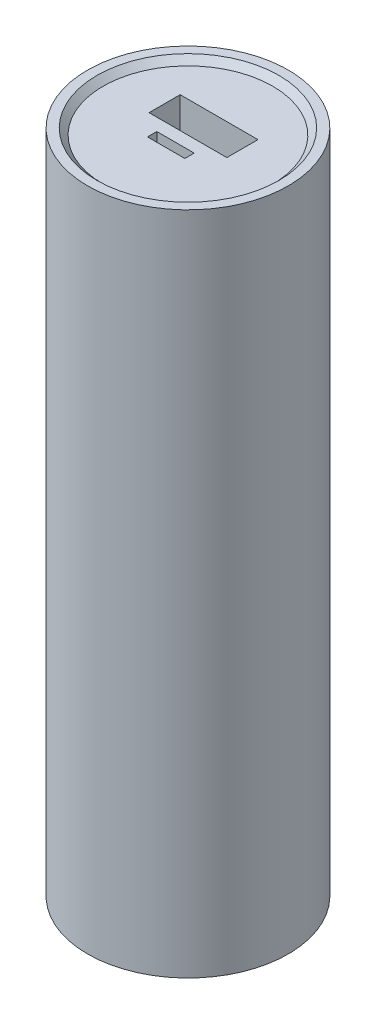
ISO-10303-21;
HEADER;
FILE_DESCRIPTION(('STEP AP214'),'2;1');
FILE_NAME('part.step','',(''),(''),'','','');
FILE_SCHEMA(('AUTOMOTIVE_DESIGN { 1 0 10303 214 1 1 1 1 }'));
ENDSEC;
DATA;
#1=APPLICATION_CONTEXT('core data for automotive mechanical design processes');
#2=APPLICATION_PROTOCOL_DEFINITION('international standard','automotive_design',2000,#1);
#3=PRODUCT_CONTEXT('',#1,'mechanical');
#4=PRODUCT('Part','Part','',(#3));
#5=PRODUCT_RELATED_PRODUCT_CATEGORY('part','',(#4));
#6=PRODUCT_DEFINITION_FORMATION('','',#4);
#7=PRODUCT_DEFINITION_CONTEXT('part definition',#1,'design');
#8=PRODUCT_DEFINITION('design','',#6,#7);
#9=PRODUCT_DEFINITION_SHAPE('','',#8);
#10=(LENGTH_UNIT() NAMED_UNIT(*) SI_UNIT(.MILLI.,.METRE.));
#11=(NAMED_UNIT(*) PLANE_ANGLE_UNIT() SI_UNIT($,.RADIAN.));
#12=(NAMED_UNIT(*) SI_UNIT($,.STERADIAN.) SOLID_ANGLE_UNIT());
#13=UNCERTAINTY_MEASURE_WITH_UNIT(LENGTH_MEASURE(1.E-05),#10,'distance_accuracy_value','');
#14=(GEOMETRIC_REPRESENTATION_CONTEXT(3) GLOBAL_UNCERTAINTY_ASSIGNED_CONTEXT((#13)) GLOBAL_UNIT_ASSIGNED_CONTEXT((#10,
#11,#12)) REPRESENTATION_CONTEXT('',''));
#15=CARTESIAN_POINT('',(0.,0.,0.));
#16=DIRECTION('',(0.,0.,1.));
#17=DIRECTION('',(1.,0.,0.));
#18=AXIS2_PLACEMENT_3D('',#15,#16,#17);
#19=CARTESIAN_POINT('',(0.,106.9,0.));
#20=DIRECTION('',(0.,-1.,0.));
#21=DIRECTION('',(0.,0.,-1.));
#22=AXIS2_PLACEMENT_3D('',#19,#20,#21);
#23=CYLINDRICAL_SURFACE('',#22,16.125);
#24=CARTESIAN_POINT('',(0.,106.9,0.));
#25=DIRECTION('',(0.,1.,0.));
#26=DIRECTION('',(0.,0.,1.));
#27=AXIS2_PLACEMENT_3D('',#24,#25,#26);
#28=CIRCLE('',#27,16.125);
#29=CARTESIAN_POINT('',(0.,106.9,16.125));
#30=VERTEX_POINT('',#29);
#31=EDGE_CURVE('E48',#30,#30,#28,.T.);
#32=ORIENTED_EDGE('',*,*,#31,.F.);
#33=EDGE_LOOP('',(#32));
#34=FACE_BOUND('',#33,.T.);
#35=CARTESIAN_POINT('',(0.,0.,0.));
#36=DIRECTION('',(0.,1.,0.));
#37=DIRECTION('',(0.,0.,1.));
#38=AXIS2_PLACEMENT_3D('',#35,#36,#37);
#39=CIRCLE('',#38,16.125);
#40=CARTESIAN_POINT('',(0.,0.,16.125));
#41=VERTEX_POINT('',#40);
#42=EDGE_CURVE('E178',#41,#41,#39,.T.);
#43=ORIENTED_EDGE('',*,*,#42,.T.);
#44=EDGE_LOOP('',(#43));
#45=FACE_BOUND('',#44,.T.);
#46=ADVANCED_FACE('F39',(#34,#45),#23,.T.);
#47=CARTESIAN_POINT('',(0.,106.9,0.));
#48=DIRECTION('',(0.,1.,0.));
#49=DIRECTION('',(0.,0.,1.));
#50=AXIS2_PLACEMENT_3D('',#47,#48,#49);
#51=PLANE('',#50);
#52=CARTESIAN_POINT('',(0.,106.9,0.));
#53=DIRECTION('',(0.,1.,0.));
#54=DIRECTION('',(0.,0.,1.));
#55=AXIS2_PLACEMENT_3D('',#52,#53,#54);
#56=CIRCLE('',#55,14.625);
#57=CARTESIAN_POINT('',(0.,106.9,14.625));
#58=VERTEX_POINT('',#57);
#59=EDGE_CURVE('E142',#58,#58,#56,.T.);
#60=ORIENTED_EDGE('',*,*,#59,.F.);
#61=EDGE_LOOP('',(#60));
#62=FACE_BOUND('',#61,.T.);
#63=ORIENTED_EDGE('',*,*,#31,.T.);
#64=EDGE_LOOP('',(#63));
#65=FACE_BOUND('',#64,.T.);
#66=ADVANCED_FACE('F187',(#62,#65),#51,.T.);
#67=CARTESIAN_POINT('',(0.,0.,0.));
#68=DIRECTION('',(0.,1.,0.));
#69=DIRECTION('',(0.,0.,1.));
#70=AXIS2_PLACEMENT_3D('',#67,#68,#69);
#71=PLANE('',#70);
#72=ORIENTED_EDGE('',*,*,#42,.F.);
#73=EDGE_LOOP('',(#72));
#74=FACE_BOUND('',#73,.T.);
#75=ADVANCED_FACE('F184',(#74),#71,.F.);
#76=CARTESIAN_POINT('',(0.,105.9,0.));
#77=DIRECTION('',(0.,1.,0.));
#78=DIRECTION('',(0.,0.,1.));
#79=AXIS2_PLACEMENT_3D('',#76,#77,#78);
#80=PLANE('',#79);
#81=DIRECTION('',(0.,0.,1.));
#82=VECTOR('',#81,1.);
#83=CARTESIAN_POINT('',(-6.25,105.9,0.));
#84=LINE('',#83,#82);
#85=CARTESIAN_POINT('',(-6.25,105.9,-5.));
#86=VERTEX_POINT('',#85);
#87=CARTESIAN_POINT('',(-6.25,105.9,0.));
#88=VERTEX_POINT('',#87);
#89=EDGE_CURVE('E112',#86,#88,#84,.T.);
#90=ORIENTED_EDGE('',*,*,#89,.F.);
#91=DIRECTION('',(-1.,0.,0.));
#92=VECTOR('',#91,1.);
#93=CARTESIAN_POINT('',(6.25,105.9,-5.));
#94=LINE('',#93,#92);
#95=CARTESIAN_POINT('',(6.25,105.9,-5.));
#96=VERTEX_POINT('',#95);
#97=EDGE_CURVE('E129',#96,#86,#94,.T.);
#98=ORIENTED_EDGE('',*,*,#97,.F.);
#99=DIRECTION('',(0.,0.,-1.));
#100=VECTOR('',#99,1.);
#101=CARTESIAN_POINT('',(6.25,105.9,0.));
#102=LINE('',#101,#100);
#103=CARTESIAN_POINT('',(6.25,105.9,0.));
#104=VERTEX_POINT('',#103);
#105=EDGE_CURVE('E55',#104,#96,#102,.T.);
#106=ORIENTED_EDGE('',*,*,#105,.F.);
#107=DIRECTION('',(1.,0.,0.));
#108=VECTOR('',#107,1.);
#109=CARTESIAN_POINT('',(6.25,105.9,0.));
#110=LINE('',#109,#108);
#111=EDGE_CURVE('E137',#88,#104,#110,.T.);
#112=ORIENTED_EDGE('',*,*,#111,.F.);
#113=EDGE_LOOP('',(#90,#98,#106,#112));
#114=FACE_BOUND('',#113,.T.);
#115=DIRECTION('',(0.,0.,1.));
#116=VECTOR('',#115,1.);
#117=CARTESIAN_POINT('',(-3.,105.9,3.5));
#118=LINE('',#117,#116);
#119=CARTESIAN_POINT('',(-3.,105.9,2.));
#120=VERTEX_POINT('',#119);
#121=CARTESIAN_POINT('',(-3.,105.9,3.5));
#122=VERTEX_POINT('',#121);
#123=EDGE_CURVE('E63',#120,#122,#118,.T.);
#124=ORIENTED_EDGE('',*,*,#123,.F.);
#125=DIRECTION('',(-1.,0.,0.));
#126=VECTOR('',#125,1.);
#127=CARTESIAN_POINT('',(3.,105.9,2.));
#128=LINE('',#127,#126);
#129=CARTESIAN_POINT('',(3.,105.9,2.));
#130=VERTEX_POINT('',#129);
#131=EDGE_CURVE('E155',#130,#120,#128,.T.);
#132=ORIENTED_EDGE('',*,*,#131,.F.);
#133=DIRECTION('',(0.,0.,-1.));
#134=VECTOR('',#133,1.);
#135=CARTESIAN_POINT('',(3.,105.9,3.5));
#136=LINE('',#135,#134);
#137=CARTESIAN_POINT('',(3.,105.9,3.5));
#138=VERTEX_POINT('',#137);
#139=EDGE_CURVE('E158',#138,#130,#136,.T.);
#140=ORIENTED_EDGE('',*,*,#139,.F.);
#141=DIRECTION('',(1.,0.,0.));
#142=VECTOR('',#141,1.);
#143=CARTESIAN_POINT('',(3.,105.9,3.5));
#144=LINE('',#143,#142);
#145=EDGE_CURVE('E162',#122,#138,#144,.T.);
#146=ORIENTED_EDGE('',*,*,#145,.F.);
#147=EDGE_LOOP('',(#124,#132,#140,#146));
#148=FACE_BOUND('',#147,.T.);
#149=CARTESIAN_POINT('',(0.,105.9,0.));
#150=DIRECTION('',(0.,1.,0.));
#151=DIRECTION('',(0.,0.,1.));
#152=AXIS2_PLACEMENT_3D('',#149,#150,#151);
#153=CIRCLE('',#152,13.625);
#154=CARTESIAN_POINT('',(0.,105.9,13.625));
#155=VERTEX_POINT('',#154);
#156=EDGE_CURVE('E11',#155,#155,#153,.T.);
#157=ORIENTED_EDGE('',*,*,#156,.T.);
#158=EDGE_LOOP('',(#157));
#159=FACE_BOUND('',#158,.T.);
#160=ADVANCED_FACE('F186',(#114,#148,#159),#80,.T.);
#161=CARTESIAN_POINT('',(0.,105.9,0.));
#162=DIRECTION('',(0.,1.,0.));
#163=DIRECTION('',(0.,0.,1.));
#164=AXIS2_PLACEMENT_3D('',#161,#162,#163);
#165=CONICAL_SURFACE('',#164,13.625,0.78539816339745);
#166=ORIENTED_EDGE('',*,*,#59,.T.);
#167=EDGE_LOOP('',(#166));
#168=FACE_BOUND('',#167,.T.);
#169=ORIENTED_EDGE('',*,*,#156,.F.);
#170=EDGE_LOOP('',(#169));
#171=FACE_BOUND('',#170,.T.);
#172=ADVANCED_FACE('F42',(#168,#171),#165,.F.);
#173=CARTESIAN_POINT('',(-3.,100.9,3.5));
#174=DIRECTION('',(-1.,0.,0.));
#175=DIRECTION('',(0.,0.,1.));
#176=AXIS2_PLACEMENT_3D('',#173,#174,#175);
#177=PLANE('',#176);
#178=ORIENTED_EDGE('',*,*,#123,.T.);
#179=DIRECTION('',(0.,1.,0.));
#180=VECTOR('',#179,1.);
#181=CARTESIAN_POINT('',(-3.,100.9,3.5));
#182=LINE('',#181,#180);
#183=CARTESIAN_POINT('',(-3.,100.9,3.5));
#184=VERTEX_POINT('',#183);
#185=EDGE_CURVE('E146',#184,#122,#182,.T.);
#186=ORIENTED_EDGE('',*,*,#185,.F.);
#187=DIRECTION('',(0.,0.,1.));
#188=VECTOR('',#187,1.);
#189=CARTESIAN_POINT('',(-3.,100.9,3.5));
#190=LINE('',#189,#188);
#191=CARTESIAN_POINT('',(-3.,100.9,2.));
#192=VERTEX_POINT('',#191);
#193=EDGE_CURVE('E159',#192,#184,#190,.T.);
#194=ORIENTED_EDGE('',*,*,#193,.F.);
#195=DIRECTION('',(0.,1.,0.));
#196=VECTOR('',#195,1.);
#197=CARTESIAN_POINT('',(-3.,100.9,2.));
#198=LINE('',#197,#196);
#199=EDGE_CURVE('E153',#192,#120,#198,.T.);
#200=ORIENTED_EDGE('',*,*,#199,.T.);
#201=EDGE_LOOP('',(#178,#186,#194,#200));
#202=FACE_BOUND('',#201,.T.);
#203=ADVANCED_FACE('F219',(#202),#177,.F.);
#204=CARTESIAN_POINT('',(3.,100.9,2.));
#205=DIRECTION('',(0.,0.,-1.));
#206=DIRECTION('',(-1.,0.,0.));
#207=AXIS2_PLACEMENT_3D('',#204,#205,#206);
#208=PLANE('',#207);
#209=ORIENTED_EDGE('',*,*,#131,.T.);
#210=ORIENTED_EDGE('',*,*,#199,.F.);
#211=DIRECTION('',(-1.,0.,0.));
#212=VECTOR('',#211,1.);
#213=CARTESIAN_POINT('',(3.,100.9,2.));
#214=LINE('',#213,#212);
#215=CARTESIAN_POINT('',(3.,100.9,2.));
#216=VERTEX_POINT('',#215);
#217=EDGE_CURVE('E148',#216,#192,#214,.T.);
#218=ORIENTED_EDGE('',*,*,#217,.F.);
#219=DIRECTION('',(0.,1.,0.));
#220=VECTOR('',#219,1.);
#221=CARTESIAN_POINT('',(3.,100.9,2.));
#222=LINE('',#221,#220);
#223=EDGE_CURVE('E151',#216,#130,#222,.T.);
#224=ORIENTED_EDGE('',*,*,#223,.T.);
#225=EDGE_LOOP('',(#209,#210,#218,#224));
#226=FACE_BOUND('',#225,.T.);
#227=ADVANCED_FACE('F236',(#226),#208,.F.);
#228=CARTESIAN_POINT('',(3.,100.9,3.5));
#229=DIRECTION('',(1.,0.,0.));
#230=DIRECTION('',(0.,0.,-1.));
#231=AXIS2_PLACEMENT_3D('',#228,#229,#230);
#232=PLANE('',#231);
#233=ORIENTED_EDGE('',*,*,#139,.T.);
#234=ORIENTED_EDGE('',*,*,#223,.F.);
#235=DIRECTION('',(0.,0.,-1.));
#236=VECTOR('',#235,1.);
#237=CARTESIAN_POINT('',(3.,100.9,3.5));
#238=LINE('',#237,#236);
#239=CARTESIAN_POINT('',(3.,100.9,3.5));
#240=VERTEX_POINT('',#239);
#241=EDGE_CURVE('E168',#240,#216,#238,.T.);
#242=ORIENTED_EDGE('',*,*,#241,.F.);
#243=DIRECTION('',(0.,1.,0.));
#244=VECTOR('',#243,1.);
#245=CARTESIAN_POINT('',(3.,100.9,3.5));
#246=LINE('',#245,#244);
#247=EDGE_CURVE('E149',#240,#138,#246,.T.);
#248=ORIENTED_EDGE('',*,*,#247,.T.);
#249=EDGE_LOOP('',(#233,#234,#242,#248));
#250=FACE_BOUND('',#249,.T.);
#251=ADVANCED_FACE('F246',(#250),#232,.F.);
#252=CARTESIAN_POINT('',(3.,100.9,3.5));
#253=DIRECTION('',(0.,0.,1.));
#254=DIRECTION('',(1.,0.,0.));
#255=AXIS2_PLACEMENT_3D('',#252,#253,#254);
#256=PLANE('',#255);
#257=ORIENTED_EDGE('',*,*,#145,.T.);
#258=ORIENTED_EDGE('',*,*,#247,.F.);
#259=DIRECTION('',(1.,0.,0.));
#260=VECTOR('',#259,1.);
#261=CARTESIAN_POINT('',(3.,100.9,3.5));
#262=LINE('',#261,#260);
#263=EDGE_CURVE('E171',#184,#240,#262,.T.);
#264=ORIENTED_EDGE('',*,*,#263,.F.);
#265=ORIENTED_EDGE('',*,*,#185,.T.);
#266=EDGE_LOOP('',(#257,#258,#264,#265));
#267=FACE_BOUND('',#266,.T.);
#268=ADVANCED_FACE('F257',(#267),#256,.F.);
#269=CARTESIAN_POINT('',(0.,100.9,0.));
#270=DIRECTION('',(0.,1.,0.));
#271=DIRECTION('',(0.,0.,1.));
#272=AXIS2_PLACEMENT_3D('',#269,#270,#271);
#273=PLANE('',#272);
#274=ORIENTED_EDGE('',*,*,#193,.T.);
#275=ORIENTED_EDGE('',*,*,#263,.T.);
#276=ORIENTED_EDGE('',*,*,#241,.T.);
#277=ORIENTED_EDGE('',*,*,#217,.T.);
#278=EDGE_LOOP('',(#274,#275,#276,#277));
#279=FACE_BOUND('',#278,.T.);
#280=ADVANCED_FACE('F268',(#279),#273,.T.);
#281=CARTESIAN_POINT('',(-6.25,100.9,0.));
#282=DIRECTION('',(-1.,0.,0.));
#283=DIRECTION('',(0.,0.,1.));
#284=AXIS2_PLACEMENT_3D('',#281,#282,#283);
#285=PLANE('',#284);
#286=ORIENTED_EDGE('',*,*,#89,.T.);
#287=DIRECTION('',(0.,1.,0.));
#288=VECTOR('',#287,1.);
#289=CARTESIAN_POINT('',(-6.25,100.9,0.));
#290=LINE('',#289,#288);
#291=CARTESIAN_POINT('',(-6.25,100.9,0.));
#292=VERTEX_POINT('',#291);
#293=EDGE_CURVE('E105',#292,#88,#290,.T.);
#294=ORIENTED_EDGE('',*,*,#293,.F.);
#295=DIRECTION('',(0.,0.,1.));
#296=VECTOR('',#295,1.);
#297=CARTESIAN_POINT('',(-6.25,100.9,0.));
#298=LINE('',#297,#296);
#299=CARTESIAN_POINT('',(-6.25,100.9,-5.));
#300=VERTEX_POINT('',#299);
#301=EDGE_CURVE('E109',#300,#292,#298,.T.);
#302=ORIENTED_EDGE('',*,*,#301,.F.);
#303=DIRECTION('',(0.,1.,0.));
#304=VECTOR('',#303,1.);
#305=CARTESIAN_POINT('',(-6.25,100.9,-5.));
#306=LINE('',#305,#304);
#307=EDGE_CURVE('E140',#300,#86,#306,.T.);
#308=ORIENTED_EDGE('',*,*,#307,.T.);
#309=EDGE_LOOP('',(#286,#294,#302,#308));
#310=FACE_BOUND('',#309,.T.);
#311=ADVANCED_FACE('F107',(#310),#285,.F.);
#312=CARTESIAN_POINT('',(6.25,100.9,-5.));
#313=DIRECTION('',(0.,0.,-1.));
#314=DIRECTION('',(-1.,0.,0.));
#315=AXIS2_PLACEMENT_3D('',#312,#313,#314);
#316=PLANE('',#315);
#317=ORIENTED_EDGE('',*,*,#97,.T.);
#318=ORIENTED_EDGE('',*,*,#307,.F.);
#319=DIRECTION('',(-1.,0.,0.));
#320=VECTOR('',#319,1.);
#321=CARTESIAN_POINT('',(6.25,100.9,-5.));
#322=LINE('',#321,#320);
#323=CARTESIAN_POINT('',(6.25,100.9,-5.));
#324=VERTEX_POINT('',#323);
#325=EDGE_CURVE('E117',#324,#300,#322,.T.);
#326=ORIENTED_EDGE('',*,*,#325,.F.);
#327=DIRECTION('',(0.,1.,0.));
#328=VECTOR('',#327,1.);
#329=CARTESIAN_POINT('',(6.25,100.9,-5.));
#330=LINE('',#329,#328);
#331=EDGE_CURVE('E143',#324,#96,#330,.T.);
#332=ORIENTED_EDGE('',*,*,#331,.T.);
#333=EDGE_LOOP('',(#317,#318,#326,#332));
#334=FACE_BOUND('',#333,.T.);
#335=ADVANCED_FACE('F289',(#334),#316,.F.);
#336=CARTESIAN_POINT('',(6.25,100.9,0.));
#337=DIRECTION('',(1.,0.,0.));
#338=DIRECTION('',(0.,0.,-1.));
#339=AXIS2_PLACEMENT_3D('',#336,#337,#338);
#340=PLANE('',#339);
#341=ORIENTED_EDGE('',*,*,#105,.T.);
#342=ORIENTED_EDGE('',*,*,#331,.F.);
#343=DIRECTION('',(0.,0.,-1.));
#344=VECTOR('',#343,1.);
#345=CARTESIAN_POINT('',(6.25,100.9,0.));
#346=LINE('',#345,#344);
#347=CARTESIAN_POINT('',(6.25,100.9,0.));
#348=VERTEX_POINT('',#347);
#349=EDGE_CURVE('E125',#348,#324,#346,.T.);
#350=ORIENTED_EDGE('',*,*,#349,.F.);
#351=DIRECTION('',(0.,1.,0.));
#352=VECTOR('',#351,1.);
#353=CARTESIAN_POINT('',(6.25,100.9,0.));
#354=LINE('',#353,#352);
#355=EDGE_CURVE('E116',#348,#104,#354,.T.);
#356=ORIENTED_EDGE('',*,*,#355,.T.);
#357=EDGE_LOOP('',(#341,#342,#350,#356));
#358=FACE_BOUND('',#357,.T.);
#359=ADVANCED_FACE('F299',(#358),#340,.F.);
#360=CARTESIAN_POINT('',(6.25,100.9,0.));
#361=DIRECTION('',(0.,0.,1.));
#362=DIRECTION('',(1.,0.,0.));
#363=AXIS2_PLACEMENT_3D('',#360,#361,#362);
#364=PLANE('',#363);
#365=ORIENTED_EDGE('',*,*,#111,.T.);
#366=ORIENTED_EDGE('',*,*,#355,.F.);
#367=DIRECTION('',(1.,0.,0.));
#368=VECTOR('',#367,1.);
#369=CARTESIAN_POINT('',(6.25,100.9,0.));
#370=LINE('',#369,#368);
#371=EDGE_CURVE('E120',#292,#348,#370,.T.);
#372=ORIENTED_EDGE('',*,*,#371,.F.);
#373=ORIENTED_EDGE('',*,*,#293,.T.);
#374=EDGE_LOOP('',(#365,#366,#372,#373));
#375=FACE_BOUND('',#374,.T.);
#376=ADVANCED_FACE('F121',(#375),#364,.F.);
#377=CARTESIAN_POINT('',(0.,100.9,0.));
#378=DIRECTION('',(0.,1.,0.));
#379=DIRECTION('',(0.,0.,1.));
#380=AXIS2_PLACEMENT_3D('',#377,#378,#379);
#381=PLANE('',#380);
#382=ORIENTED_EDGE('',*,*,#301,.T.);
#383=ORIENTED_EDGE('',*,*,#371,.T.);
#384=ORIENTED_EDGE('',*,*,#349,.T.);
#385=ORIENTED_EDGE('',*,*,#325,.T.);
#386=EDGE_LOOP('',(#382,#383,#384,#385));
#387=FACE_BOUND('',#386,.T.);
#388=ADVANCED_FACE('F127',(#387),#381,.T.);
#389=CLOSED_SHELL('',(#46,#66,#75,#160,#172,#203,#227,#251,#268,#280,#311,#335,#359,#376,#388));
#390=MANIFOLD_SOLID_BREP('B2',#389);
#391=ADVANCED_BREP_SHAPE_REPRESENTATION('',(#18,#390),#14);
#392=SHAPE_DEFINITION_REPRESENTATION(#9,#391);
ENDSEC;
END-ISO-10303-21;
